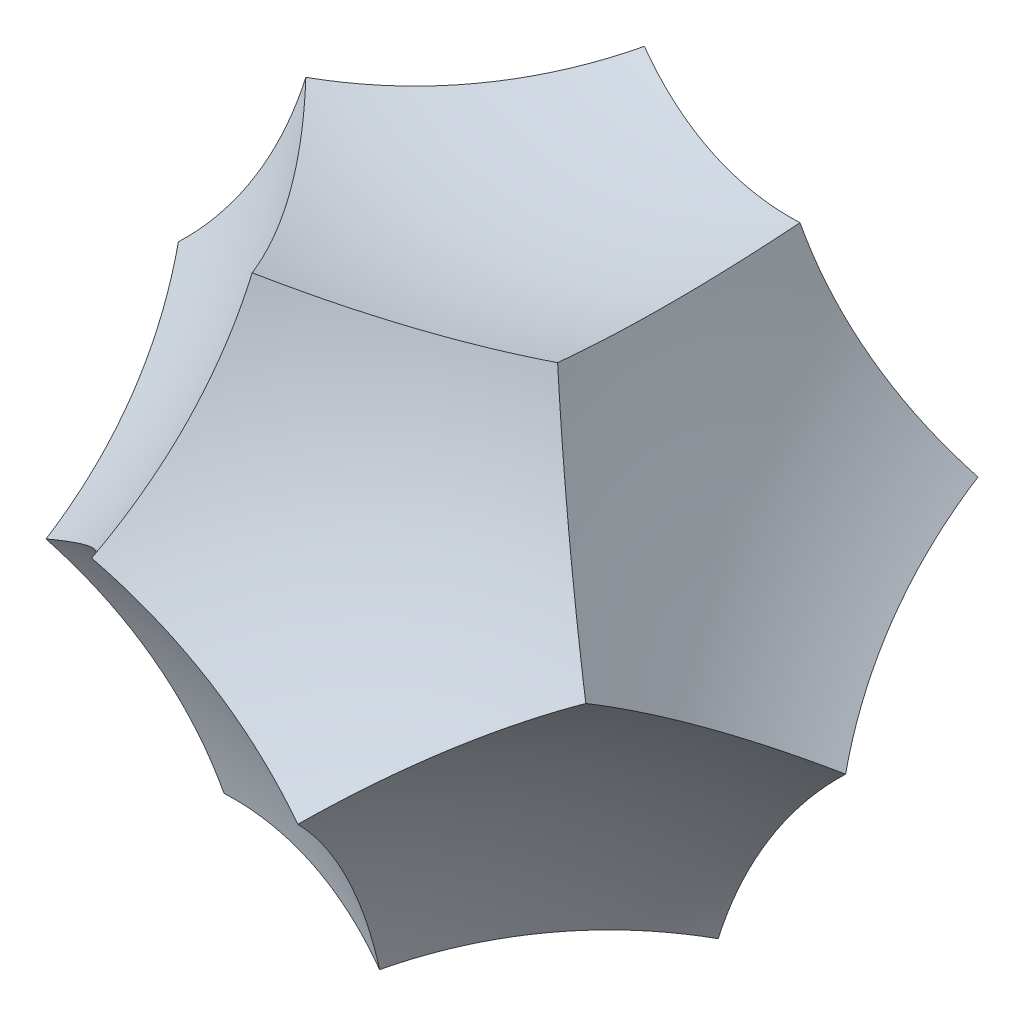
ISO-10303-21;
HEADER;
FILE_DESCRIPTION(('STEP AP214'),'2;1');
FILE_NAME('part.step','',(''),(''),'','','');
FILE_SCHEMA(('AUTOMOTIVE_DESIGN { 1 0 10303 214 1 1 1 1 }'));
ENDSEC;
DATA;
#1=APPLICATION_CONTEXT('core data for automotive mechanical design processes');
#2=APPLICATION_PROTOCOL_DEFINITION('international standard','automotive_design',2000,#1);
#3=PRODUCT_CONTEXT('',#1,'mechanical');
#4=PRODUCT('Part','Part','',(#3));
#5=PRODUCT_RELATED_PRODUCT_CATEGORY('part','',(#4));
#6=PRODUCT_DEFINITION_FORMATION('','',#4);
#7=PRODUCT_DEFINITION_CONTEXT('part definition',#1,'design');
#8=PRODUCT_DEFINITION('design','',#6,#7);
#9=PRODUCT_DEFINITION_SHAPE('','',#8);
#10=(LENGTH_UNIT() NAMED_UNIT(*) SI_UNIT(.MILLI.,.METRE.));
#11=(NAMED_UNIT(*) PLANE_ANGLE_UNIT() SI_UNIT($,.RADIAN.));
#12=(NAMED_UNIT(*) SI_UNIT($,.STERADIAN.) SOLID_ANGLE_UNIT());
#13=UNCERTAINTY_MEASURE_WITH_UNIT(LENGTH_MEASURE(1.E-05),#10,'distance_accuracy_value','');
#14=(GEOMETRIC_REPRESENTATION_CONTEXT(3) GLOBAL_UNCERTAINTY_ASSIGNED_CONTEXT((#13)) GLOBAL_UNIT_ASSIGNED_CONTEXT((#10,
#11,#12)) REPRESENTATION_CONTEXT('',''));
#15=CARTESIAN_POINT('',(0.,0.,0.));
#16=DIRECTION('',(0.,0.,1.));
#17=DIRECTION('',(1.,0.,0.));
#18=AXIS2_PLACEMENT_3D('',#15,#16,#17);
#19=CARTESIAN_POINT('',(0.,141.005901871464,0.));
#20=DIRECTION('',(0.,1.,0.));
#21=DIRECTION('',(-1.,0.,0.));
#22=AXIS2_PLACEMENT_3D('',#19,#20,#21);
#23=SPHERICAL_SURFACE('',#22,104.837333736005);
#24=CARTESIAN_POINT('',(63.0597563626517,102.032829117058,0.));
#25=DIRECTION('',(0.850650808352041,-0.525731112119132,0.));
#26=DIRECTION('',(0.525731112119132,0.850650808352041,0.));
#27=AXIS2_PLACEMENT_3D('',#24,#25,#26);
#28=CIRCLE('',#27,74.1311896062465);
#29=CARTESIAN_POINT('',(25.3042075972347,40.9430679507093,18.3845829568674));
#30=VERTEX_POINT('',#29);
#31=CARTESIAN_POINT('',(25.3042075972347,40.9430679507092,-18.3845829568671));
#32=VERTEX_POINT('',#31);
#33=EDGE_CURVE('E126',#30,#32,#28,.T.);
#34=ORIENTED_EDGE('',*,*,#33,.T.);
#35=CARTESIAN_POINT('',(19.4865363772038,102.032829117058,-59.9733922046844));
#36=DIRECTION('',(0.262865556059576,-0.525731112119132,-0.809016994374946));
#37=DIRECTION('',(0.,0.838505147446964,-0.544893675596391));
#38=AXIS2_PLACEMENT_3D('',#35,#36,#37);
#39=CIRCLE('',#38,74.1311896062466);
#40=CARTESIAN_POINT('',(-9.66534724376006,40.9430679507093,-29.7468800932036));
#41=VERTEX_POINT('',#40);
#42=EDGE_CURVE('E116',#32,#41,#39,.T.);
#43=ORIENTED_EDGE('',*,*,#42,.T.);
#44=CARTESIAN_POINT('',(-51.0164145585286,102.032829117058,-37.0655948031235));
#45=DIRECTION('',(-0.688190960235583,-0.525731112119132,-0.500000000000007));
#46=DIRECTION('',(0.607061998206687,-0.794654472291766,0.));
#47=AXIS2_PLACEMENT_3D('',#44,#45,#46);
#48=CIRCLE('',#47,74.1311896062466);
#49=CARTESIAN_POINT('',(-31.2777207069488,40.9430679507092,-2.23802686464158E-13));
#50=VERTEX_POINT('',#49);
#51=EDGE_CURVE('E123',#41,#50,#48,.T.);
#52=ORIENTED_EDGE('',*,*,#51,.T.);
#53=CARTESIAN_POINT('',(-51.0164145585291,102.032829117058,37.0655948031228));
#54=DIRECTION('',(-0.688190960235591,-0.525731112119132,0.499999999999997));
#55=DIRECTION('',(0.607061998206683,-0.794654472291769,0.));
#56=AXIS2_PLACEMENT_3D('',#53,#54,#55);
#57=CIRCLE('',#56,74.1311896062466);
#58=CARTESIAN_POINT('',(-9.66534724376053,40.9430679507093,29.7468800932035));
#59=VERTEX_POINT('',#58);
#60=EDGE_CURVE('E158',#50,#59,#57,.T.);
#61=ORIENTED_EDGE('',*,*,#60,.T.);
#62=CARTESIAN_POINT('',(19.4865363772029,102.032829117058,59.9733922046847));
#63=DIRECTION('',(0.262865556059565,-0.525731112119132,0.809016994374949));
#64=DIRECTION('',(0.,-0.838505147446965,-0.544893675596389));
#65=AXIS2_PLACEMENT_3D('',#62,#63,#64);
#66=CIRCLE('',#65,74.1311896062466);
#67=EDGE_CURVE('E172',#59,#30,#66,.T.);
#68=ORIENTED_EDGE('',*,*,#67,.T.);
#69=EDGE_LOOP('',(#34,#43,#52,#61,#68));
#70=FACE_BOUND('',#69,.T.);
#71=ADVANCED_FACE('F41',(#70),#23,.F.);
#72=CARTESIAN_POINT('',(0.,-141.005901871464,0.));
#73=DIRECTION('',(0.,-1.,0.));
#74=DIRECTION('',(-1.,0.,0.));
#75=AXIS2_PLACEMENT_3D('',#72,#73,#74);
#76=SPHERICAL_SURFACE('',#75,104.837333736005);
#77=CARTESIAN_POINT('',(51.0164145585286,-102.032829117058,37.0655948031235));
#78=DIRECTION('',(0.688190960235583,0.525731112119131,0.500000000000007));
#79=DIRECTION('',(-0.607061998206686,0.794654472291766,0.));
#80=AXIS2_PLACEMENT_3D('',#77,#78,#79);
#81=CIRCLE('',#80,74.1311896062466);
#82=CARTESIAN_POINT('',(31.2777207069488,-40.9430679507092,2.23802686464158E-13));
#83=VERTEX_POINT('',#82);
#84=CARTESIAN_POINT('',(9.66534724376006,-40.9430679507092,29.7468800932036));
#85=VERTEX_POINT('',#84);
#86=EDGE_CURVE('E151',#83,#85,#81,.T.);
#87=ORIENTED_EDGE('',*,*,#86,.T.);
#88=CARTESIAN_POINT('',(-19.4865363772038,-102.032829117058,59.9733922046844));
#89=DIRECTION('',(-0.262865556059576,0.525731112119132,0.809016994374946));
#90=DIRECTION('',(0.,-0.838505147446964,0.544893675596391));
#91=AXIS2_PLACEMENT_3D('',#88,#89,#90);
#92=CIRCLE('',#91,74.1311896062466);
#93=CARTESIAN_POINT('',(-25.3042075972347,-40.9430679507092,18.3845829568671));
#94=VERTEX_POINT('',#93);
#95=EDGE_CURVE('E63',#85,#94,#92,.T.);
#96=ORIENTED_EDGE('',*,*,#95,.T.);
#97=CARTESIAN_POINT('',(-63.0597563626516,-102.032829117058,0.));
#98=DIRECTION('',(-0.850650808352041,0.525731112119132,0.));
#99=DIRECTION('',(-0.525731112119132,-0.850650808352041,0.));
#100=AXIS2_PLACEMENT_3D('',#97,#98,#99);
#101=CIRCLE('',#100,74.1311896062466);
#102=CARTESIAN_POINT('',(-25.3042075972347,-40.9430679507093,-18.3845829568674));
#103=VERTEX_POINT('',#102);
#104=EDGE_CURVE('E179',#94,#103,#101,.T.);
#105=ORIENTED_EDGE('',*,*,#104,.T.);
#106=CARTESIAN_POINT('',(-19.4865363772029,-102.032829117058,-59.9733922046847));
#107=DIRECTION('',(-0.262865556059565,0.525731112119132,-0.809016994374949));
#108=DIRECTION('',(0.,0.838505147446965,0.544893675596389));
#109=AXIS2_PLACEMENT_3D('',#106,#107,#108);
#110=CIRCLE('',#109,74.1311896062466);
#111=CARTESIAN_POINT('',(9.66534724376052,-40.9430679507093,-29.7468800932034));
#112=VERTEX_POINT('',#111);
#113=EDGE_CURVE('E175',#103,#112,#110,.T.);
#114=ORIENTED_EDGE('',*,*,#113,.T.);
#115=CARTESIAN_POINT('',(51.0164145585291,-102.032829117058,-37.0655948031228));
#116=DIRECTION('',(0.688190960235591,0.525731112119131,-0.499999999999997));
#117=DIRECTION('',(-0.607061998206682,0.794654472291769,0.));
#118=AXIS2_PLACEMENT_3D('',#115,#116,#117);
#119=CIRCLE('',#118,74.1311896062466);
#120=EDGE_CURVE('E164',#112,#83,#119,.T.);
#121=ORIENTED_EDGE('',*,*,#120,.T.);
#122=EDGE_LOOP('',(#87,#96,#105,#114,#121));
#123=FACE_BOUND('',#122,.T.);
#124=ADVANCED_FACE('F211',(#123),#76,.F.);
#125=CARTESIAN_POINT('',(-126.119512725303,-63.0597563626523,0.));
#126=DIRECTION('',(-0.894427190999914,-0.447213595499962,0.));
#127=DIRECTION('',(0.447213595499962,-0.894427190999914,0.));
#128=AXIS2_PLACEMENT_3D('',#125,#126,#127);
#129=SPHERICAL_SURFACE('',#128,104.837333736005);
#130=ORIENTED_EDGE('',*,*,#104,.F.);
#131=CARTESIAN_POINT('',(-82.5462927398554,-63.0597563626523,59.9733922046844));
#132=DIRECTION('',(0.587785252292469,0.,0.809016994374951));
#133=DIRECTION('',(0.809016994374951,0.,-0.587785252292469));
#134=AXIS2_PLACEMENT_3D('',#131,#132,#133);
#135=CIRCLE('',#134,74.131189606247);
#136=CARTESIAN_POINT('',(-40.9430679507095,-9.66534724376015,29.7468800932034));
#137=VERTEX_POINT('',#136);
#138=EDGE_CURVE('E144',#94,#137,#135,.T.);
#139=ORIENTED_EDGE('',*,*,#138,.T.);
#140=CARTESIAN_POINT('',(-114.076170921181,0.,37.0655948031228));
#141=DIRECTION('',(0.162459848116449,0.850650808352045,0.499999999999993));
#142=DIRECTION('',(0.,-0.506731853971379,0.86210372239698));
#143=AXIS2_PLACEMENT_3D('',#140,#141,#142);
#144=CIRCLE('',#143,74.131189606246);
#145=CARTESIAN_POINT('',(-50.60841519447,9.6653472437604,-3.66756997997888E-13));
#146=VERTEX_POINT('',#145);
#147=EDGE_CURVE('E161',#137,#146,#144,.T.);
#148=ORIENTED_EDGE('',*,*,#147,.T.);
#149=CARTESIAN_POINT('',(-114.07617092118,0.,-37.0655948031235));
#150=DIRECTION('',(0.162459848116456,0.850650808352039,-0.5));
#151=DIRECTION('',(0.,0.506731853971387,0.862103722396975));
#152=AXIS2_PLACEMENT_3D('',#149,#150,#151);
#153=CIRCLE('',#152,74.1311896062456);
#154=CARTESIAN_POINT('',(-40.9430679507095,-9.66534724376039,-29.7468800932038));
#155=VERTEX_POINT('',#154);
#156=EDGE_CURVE('E137',#146,#155,#153,.T.);
#157=ORIENTED_EDGE('',*,*,#156,.T.);
#158=CARTESIAN_POINT('',(-82.5462927398545,-63.0597563626523,-59.9733922046847));
#159=DIRECTION('',(0.587785252292474,0.,-0.809016994374947));
#160=DIRECTION('',(-0.809016994374947,0.,-0.587785252292474));
#161=AXIS2_PLACEMENT_3D('',#158,#159,#160);
#162=CIRCLE('',#161,74.1311896062463);
#163=EDGE_CURVE('E184',#155,#103,#162,.T.);
#164=ORIENTED_EDGE('',*,*,#163,.T.);
#165=EDGE_LOOP('',(#130,#139,#148,#157,#164));
#166=FACE_BOUND('',#165,.T.);
#167=ADVANCED_FACE('F244',(#166),#129,.F.);
#168=CARTESIAN_POINT('',(126.119512725303,63.0597563626523,0.));
#169=DIRECTION('',(0.894427190999914,0.447213595499962,0.));
#170=DIRECTION('',(0.447213595499962,-0.894427190999914,0.));
#171=AXIS2_PLACEMENT_3D('',#168,#169,#170);
#172=SPHERICAL_SURFACE('',#171,104.837333736005);
#173=CARTESIAN_POINT('',(114.076170921181,0.,-37.0655948031228));
#174=DIRECTION('',(-0.162459848116449,-0.850650808352045,-0.499999999999993));
#175=DIRECTION('',(0.,0.506731853971379,-0.86210372239698));
#176=AXIS2_PLACEMENT_3D('',#173,#174,#175);
#177=CIRCLE('',#176,74.131189606246);
#178=CARTESIAN_POINT('',(50.60841519447,-9.66534724376043,3.66756997997888E-13));
#179=VERTEX_POINT('',#178);
#180=CARTESIAN_POINT('',(40.9430679507095,9.66534724376012,-29.7468800932034));
#181=VERTEX_POINT('',#180);
#182=EDGE_CURVE('E168',#179,#181,#177,.T.);
#183=ORIENTED_EDGE('',*,*,#182,.T.);
#184=CARTESIAN_POINT('',(82.5462927398554,63.0597563626523,-59.9733922046844));
#185=DIRECTION('',(-0.587785252292469,0.,-0.809016994374951));
#186=DIRECTION('',(-0.809016994374951,0.,0.587785252292469));
#187=AXIS2_PLACEMENT_3D('',#184,#185,#186);
#188=CIRCLE('',#187,74.131189606247);
#189=EDGE_CURVE('E230',#181,#32,#188,.T.);
#190=ORIENTED_EDGE('',*,*,#189,.T.);
#191=ORIENTED_EDGE('',*,*,#33,.F.);
#192=CARTESIAN_POINT('',(82.5462927398545,63.0597563626523,59.9733922046847));
#193=DIRECTION('',(-0.587785252292474,0.,0.809016994374947));
#194=DIRECTION('',(0.809016994374947,0.,0.587785252292474));
#195=AXIS2_PLACEMENT_3D('',#192,#193,#194);
#196=CIRCLE('',#195,74.1311896062463);
#197=CARTESIAN_POINT('',(40.9430679507095,9.66534724376037,29.7468800932038));
#198=VERTEX_POINT('',#197);
#199=EDGE_CURVE('E188',#30,#198,#196,.T.);
#200=ORIENTED_EDGE('',*,*,#199,.T.);
#201=CARTESIAN_POINT('',(114.07617092118,0.,37.0655948031235));
#202=DIRECTION('',(-0.162459848116456,-0.850650808352039,0.5));
#203=DIRECTION('',(0.,-0.506731853971387,-0.862103722396975));
#204=AXIS2_PLACEMENT_3D('',#201,#202,#203);
#205=CIRCLE('',#204,74.1311896062456);
#206=EDGE_CURVE('E141',#198,#179,#205,.T.);
#207=ORIENTED_EDGE('',*,*,#206,.T.);
#208=EDGE_LOOP('',(#183,#190,#191,#200,#207));
#209=FACE_BOUND('',#208,.T.);
#210=ADVANCED_FACE('F221',(#209),#172,.F.);
#211=CARTESIAN_POINT('',(-38.9730727544058,-63.0597563626523,-119.946784409369));
#212=DIRECTION('',(-0.276393202250018,-0.447213595499962,-0.850650808352039));
#213=DIRECTION('',(0.138196601125011,-0.894427190999914,0.425325404176024));
#214=AXIS2_PLACEMENT_3D('',#211,#212,#213);
#215=SPHERICAL_SURFACE('',#214,104.837333736005);
#216=CARTESIAN_POINT('',(-70.5029509357315,0.,-97.0389870078082));
#217=DIRECTION('',(-0.425325404176016,0.850650808352045,0.30901699437494));
#218=DIRECTION('',(-0.894427190999919,-0.447213595499952,0.));
#219=AXIS2_PLACEMENT_3D('',#216,#217,#218);
#220=CIRCLE('',#219,74.1311896062461);
#221=CARTESIAN_POINT('',(-15.638860353474,9.6653472437604,-48.1314630500715));
#222=VERTEX_POINT('',#221);
#223=EDGE_CURVE('E136',#155,#222,#220,.T.);
#224=ORIENTED_EDGE('',*,*,#223,.T.);
#225=CARTESIAN_POINT('',(8.46545056276682E-13,0.,-119.946784409369));
#226=DIRECTION('',(0.525731112119134,0.850650808352039,0.));
#227=DIRECTION('',(-0.85065080835204,0.525731112119134,0.));
#228=AXIS2_PLACEMENT_3D('',#225,#226,#227);
#229=CIRCLE('',#228,74.1311896062456);
#230=CARTESIAN_POINT('',(15.6388603534748,-9.6653472437604,-48.1314630500713));
#231=VERTEX_POINT('',#230);
#232=EDGE_CURVE('E56',#222,#231,#229,.T.);
#233=ORIENTED_EDGE('',*,*,#232,.T.);
#234=CARTESIAN_POINT('',(31.5298781813262,-63.0597563626523,-97.0389870078074));
#235=DIRECTION('',(0.951056516295152,0.,0.309016994374951));
#236=DIRECTION('',(0.309016994374951,0.,-0.951056516295152));
#237=AXIS2_PLACEMENT_3D('',#234,#235,#236);
#238=CIRCLE('',#237,74.1311896062463);
#239=EDGE_CURVE('E192',#231,#112,#238,.T.);
#240=ORIENTED_EDGE('',*,*,#239,.T.);
#241=ORIENTED_EDGE('',*,*,#113,.F.);
#242=ORIENTED_EDGE('',*,*,#163,.F.);
#243=EDGE_LOOP('',(#224,#233,#240,#241,#242));
#244=FACE_BOUND('',#243,.T.);
#245=ADVANCED_FACE('F267',(#244),#215,.F.);
#246=CARTESIAN_POINT('',(38.9730727544058,63.0597563626523,119.946784409369));
#247=DIRECTION('',(0.276393202250018,0.447213595499962,0.850650808352039));
#248=DIRECTION('',(0.13819660112501,-0.894427190999914,0.425325404176024));
#249=AXIS2_PLACEMENT_3D('',#246,#247,#248);
#250=SPHERICAL_SURFACE('',#249,104.837333736005);
#251=CARTESIAN_POINT('',(-31.5298781813262,63.0597563626523,97.0389870078074));
#252=DIRECTION('',(-0.951056516295152,0.,-0.309016994374951));
#253=DIRECTION('',(-0.309016994374951,0.,0.951056516295152));
#254=AXIS2_PLACEMENT_3D('',#251,#252,#253);
#255=CIRCLE('',#254,74.1311896062463);
#256=CARTESIAN_POINT('',(-15.6388603534748,9.66534724376039,48.1314630500713));
#257=VERTEX_POINT('',#256);
#258=EDGE_CURVE('E195',#59,#257,#255,.T.);
#259=ORIENTED_EDGE('',*,*,#258,.T.);
#260=CARTESIAN_POINT('',(-8.46545056276682E-13,0.,119.946784409369));
#261=DIRECTION('',(-0.525731112119134,-0.850650808352039,0.));
#262=DIRECTION('',(0.85065080835204,-0.525731112119134,0.));
#263=AXIS2_PLACEMENT_3D('',#260,#261,#262);
#264=CIRCLE('',#263,74.1311896062456);
#265=CARTESIAN_POINT('',(15.638860353474,-9.66534724376042,48.1314630500715));
#266=VERTEX_POINT('',#265);
#267=EDGE_CURVE('E226',#257,#266,#264,.T.);
#268=ORIENTED_EDGE('',*,*,#267,.T.);
#269=CARTESIAN_POINT('',(70.5029509357315,0.,97.0389870078082));
#270=DIRECTION('',(0.425325404176016,-0.850650808352045,-0.30901699437494));
#271=DIRECTION('',(0.894427190999919,0.447213595499952,0.));
#272=AXIS2_PLACEMENT_3D('',#269,#270,#271);
#273=CIRCLE('',#272,74.1311896062461);
#274=EDGE_CURVE('E155',#266,#198,#273,.T.);
#275=ORIENTED_EDGE('',*,*,#274,.T.);
#276=ORIENTED_EDGE('',*,*,#199,.F.);
#277=ORIENTED_EDGE('',*,*,#67,.F.);
#278=EDGE_LOOP('',(#259,#268,#275,#276,#277));
#279=FACE_BOUND('',#278,.T.);
#280=ADVANCED_FACE('F225',(#279),#250,.F.);
#281=CARTESIAN_POINT('',(102.032829117058,-63.0597563626523,-74.1311896062456));
#282=DIRECTION('',(0.72360679774998,-0.447213595499962,-0.525731112119128));
#283=DIRECTION('',(-0.361803398874994,-0.894427190999914,0.262865556059567));
#284=AXIS2_PLACEMENT_3D('',#281,#282,#283);
#285=SPHERICAL_SURFACE('',#284,104.837333736005);
#286=ORIENTED_EDGE('',*,*,#239,.F.);
#287=CARTESIAN_POINT('',(70.5029509357329,0.,-97.0389870078072));
#288=DIRECTION('',(-0.425325404176011,0.850650808352045,-0.309016994374947));
#289=DIRECTION('',(-0.894427190999921,-0.447213595499949,0.));
#290=AXIS2_PLACEMENT_3D('',#287,#288,#289);
#291=CIRCLE('',#290,74.131189606246);
#292=EDGE_CURVE('E128',#231,#181,#291,.T.);
#293=ORIENTED_EDGE('',*,*,#292,.T.);
#294=ORIENTED_EDGE('',*,*,#182,.F.);
#295=CARTESIAN_POINT('',(102.032829117058,-63.0597563626523,7.35522753814166E-13));
#296=DIRECTION('',(0.,0.,1.));
#297=DIRECTION('',(1.,0.,0.));
#298=AXIS2_PLACEMENT_3D('',#295,#296,#297);
#299=CIRCLE('',#298,74.1311896062463);
#300=EDGE_CURVE('E199',#179,#83,#299,.T.);
#301=ORIENTED_EDGE('',*,*,#300,.T.);
#302=ORIENTED_EDGE('',*,*,#120,.F.);
#303=EDGE_LOOP('',(#286,#293,#294,#301,#302));
#304=FACE_BOUND('',#303,.T.);
#305=ADVANCED_FACE('F217',(#304),#285,.F.);
#306=CARTESIAN_POINT('',(-102.032829117058,63.0597563626523,74.1311896062456));
#307=DIRECTION('',(-0.723606797749981,0.447213595499962,0.525731112119129));
#308=DIRECTION('',(-0.361803398874994,-0.894427190999914,0.262865556059567));
#309=AXIS2_PLACEMENT_3D('',#306,#307,#308);
#310=SPHERICAL_SURFACE('',#309,104.837333736005);
#311=ORIENTED_EDGE('',*,*,#147,.F.);
#312=CARTESIAN_POINT('',(-70.5029509357329,0.,97.0389870078072));
#313=DIRECTION('',(0.425325404176011,-0.850650808352045,0.309016994374947));
#314=DIRECTION('',(0.894427190999921,0.447213595499949,0.));
#315=AXIS2_PLACEMENT_3D('',#312,#313,#314);
#316=CIRCLE('',#315,74.131189606246);
#317=EDGE_CURVE('E234',#137,#257,#316,.T.);
#318=ORIENTED_EDGE('',*,*,#317,.T.);
#319=ORIENTED_EDGE('',*,*,#258,.F.);
#320=ORIENTED_EDGE('',*,*,#60,.F.);
#321=CARTESIAN_POINT('',(-102.032829117058,63.0597563626523,-7.35522753814166E-13));
#322=DIRECTION('',(0.,0.,-1.));
#323=DIRECTION('',(-1.,0.,0.));
#324=AXIS2_PLACEMENT_3D('',#321,#322,#323);
#325=CIRCLE('',#324,74.1311896062463);
#326=EDGE_CURVE('E133',#50,#146,#325,.T.);
#327=ORIENTED_EDGE('',*,*,#326,.T.);
#328=EDGE_LOOP('',(#311,#318,#319,#320,#327));
#329=FACE_BOUND('',#328,.T.);
#330=ADVANCED_FACE('F246',(#329),#310,.F.);
#331=CARTESIAN_POINT('',(102.032829117057,-63.0597563626523,74.131189606247));
#332=DIRECTION('',(0.723606797749973,-0.447213595499962,0.525731112119139));
#333=DIRECTION('',(-0.361803398874991,-0.894427190999914,-0.262865556059573));
#334=AXIS2_PLACEMENT_3D('',#331,#332,#333);
#335=SPHERICAL_SURFACE('',#334,104.837333736005);
#336=ORIENTED_EDGE('',*,*,#274,.F.);
#337=CARTESIAN_POINT('',(31.5298781813248,-63.0597563626523,97.0389870078079));
#338=DIRECTION('',(-0.951056516295157,0.,0.309016994374938));
#339=DIRECTION('',(0.309016994374938,0.,0.951056516295157));
#340=AXIS2_PLACEMENT_3D('',#337,#338,#339);
#341=CIRCLE('',#340,74.1311896062463);
#342=EDGE_CURVE('E49',#266,#85,#341,.T.);
#343=ORIENTED_EDGE('',*,*,#342,.T.);
#344=ORIENTED_EDGE('',*,*,#86,.F.);
#345=ORIENTED_EDGE('',*,*,#300,.F.);
#346=ORIENTED_EDGE('',*,*,#206,.F.);
#347=EDGE_LOOP('',(#336,#343,#344,#345,#346));
#348=FACE_BOUND('',#347,.T.);
#349=ADVANCED_FACE('F207',(#348),#335,.F.);
#350=CARTESIAN_POINT('',(-102.032829117057,63.0597563626523,-74.131189606247));
#351=DIRECTION('',(-0.723606797749973,0.447213595499962,-0.525731112119139));
#352=DIRECTION('',(-0.36180339887499,-0.894427190999914,-0.262865556059572));
#353=AXIS2_PLACEMENT_3D('',#350,#351,#352);
#354=SPHERICAL_SURFACE('',#353,104.837333736005);
#355=ORIENTED_EDGE('',*,*,#51,.F.);
#356=CARTESIAN_POINT('',(-31.5298781813248,63.0597563626523,-97.0389870078079));
#357=DIRECTION('',(0.951056516295157,0.,-0.309016994374938));
#358=DIRECTION('',(-0.309016994374938,0.,-0.951056516295157));
#359=AXIS2_PLACEMENT_3D('',#356,#357,#358);
#360=CIRCLE('',#359,74.1311896062463);
#361=EDGE_CURVE('E11',#41,#222,#360,.T.);
#362=ORIENTED_EDGE('',*,*,#361,.T.);
#363=ORIENTED_EDGE('',*,*,#223,.F.);
#364=ORIENTED_EDGE('',*,*,#156,.F.);
#365=ORIENTED_EDGE('',*,*,#326,.F.);
#366=EDGE_LOOP('',(#355,#362,#363,#364,#365));
#367=FACE_BOUND('',#366,.T.);
#368=ADVANCED_FACE('F130',(#367),#354,.F.);
#369=CARTESIAN_POINT('',(-38.9730727544075,-63.0597563626523,119.946784409369));
#370=DIRECTION('',(-0.27639320225003,-0.447213595499962,0.850650808352035));
#371=DIRECTION('',(0.138196601125017,-0.894427190999914,-0.425325404176023));
#372=AXIS2_PLACEMENT_3D('',#369,#370,#371);
#373=SPHERICAL_SURFACE('',#372,104.837333736005);
#374=ORIENTED_EDGE('',*,*,#95,.F.);
#375=ORIENTED_EDGE('',*,*,#342,.F.);
#376=ORIENTED_EDGE('',*,*,#267,.F.);
#377=ORIENTED_EDGE('',*,*,#317,.F.);
#378=ORIENTED_EDGE('',*,*,#138,.F.);
#379=EDGE_LOOP('',(#374,#375,#376,#377,#378));
#380=FACE_BOUND('',#379,.T.);
#381=ADVANCED_FACE('F247',(#380),#373,.F.);
#382=CARTESIAN_POINT('',(38.9730727544075,63.0597563626523,-119.946784409369));
#383=DIRECTION('',(0.27639320225003,0.447213595499962,-0.850650808352035));
#384=DIRECTION('',(0.138196601125016,-0.894427190999914,-0.425325404176022));
#385=AXIS2_PLACEMENT_3D('',#382,#383,#384);
#386=SPHERICAL_SURFACE('',#385,104.837333736005);
#387=ORIENTED_EDGE('',*,*,#292,.F.);
#388=ORIENTED_EDGE('',*,*,#232,.F.);
#389=ORIENTED_EDGE('',*,*,#361,.F.);
#390=ORIENTED_EDGE('',*,*,#42,.F.);
#391=ORIENTED_EDGE('',*,*,#189,.F.);
#392=EDGE_LOOP('',(#387,#388,#389,#390,#391));
#393=FACE_BOUND('',#392,.T.);
#394=ADVANCED_FACE('F115',(#393),#386,.F.);
#395=CLOSED_SHELL('',(#71,#124,#167,#210,#245,#280,#305,#330,#349,#368,#381,#394));
#396=MANIFOLD_SOLID_BREP('B2',#395);
#397=ADVANCED_BREP_SHAPE_REPRESENTATION('',(#18,#396),#14);
#398=SHAPE_DEFINITION_REPRESENTATION(#9,#397);
ENDSEC;
END-ISO-10303-21;
